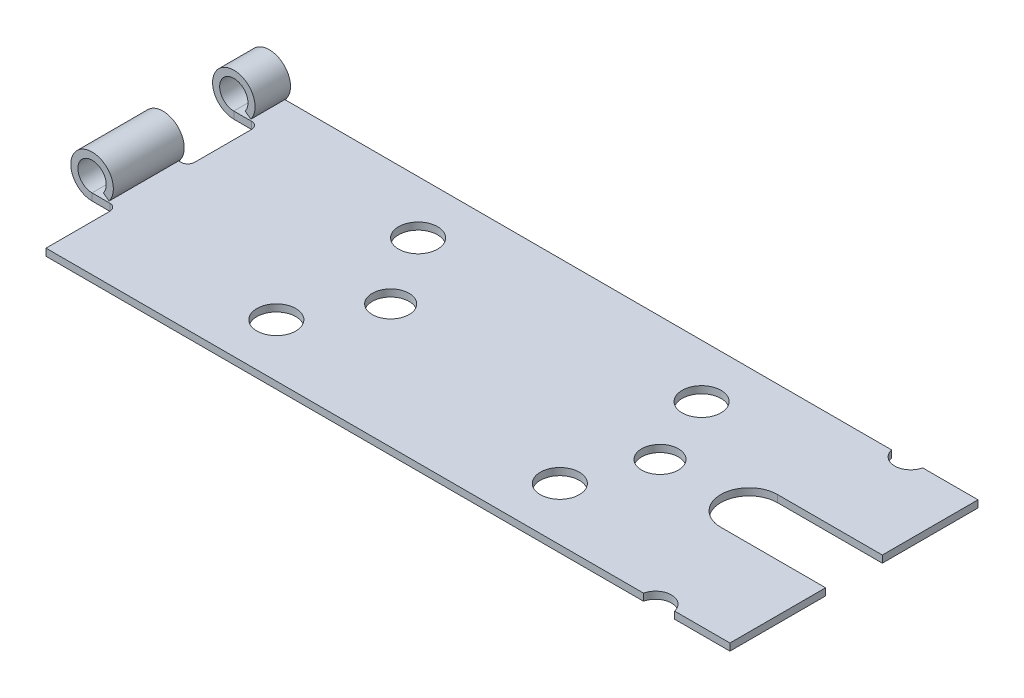
ISO-10303-21;
HEADER;
FILE_DESCRIPTION(('STEP AP214'),'2;1');
FILE_NAME('part.step','',(''),(''),'','','');
FILE_SCHEMA(('AUTOMOTIVE_DESIGN { 1 0 10303 214 1 1 1 1 }'));
ENDSEC;
DATA;
#1=APPLICATION_CONTEXT('core data for automotive mechanical design processes');
#2=APPLICATION_PROTOCOL_DEFINITION('international standard','automotive_design',2000,#1);
#3=PRODUCT_CONTEXT('',#1,'mechanical');
#4=PRODUCT('Part','Part','',(#3));
#5=PRODUCT_RELATED_PRODUCT_CATEGORY('part','',(#4));
#6=PRODUCT_DEFINITION_FORMATION('','',#4);
#7=PRODUCT_DEFINITION_CONTEXT('part definition',#1,'design');
#8=PRODUCT_DEFINITION('design','',#6,#7);
#9=PRODUCT_DEFINITION_SHAPE('','',#8);
#10=(LENGTH_UNIT() NAMED_UNIT(*) SI_UNIT(.MILLI.,.METRE.));
#11=(NAMED_UNIT(*) PLANE_ANGLE_UNIT() SI_UNIT($,.RADIAN.));
#12=(NAMED_UNIT(*) SI_UNIT($,.STERADIAN.) SOLID_ANGLE_UNIT());
#13=UNCERTAINTY_MEASURE_WITH_UNIT(LENGTH_MEASURE(1.E-05),#10,'distance_accuracy_value','');
#14=(GEOMETRIC_REPRESENTATION_CONTEXT(3) GLOBAL_UNCERTAINTY_ASSIGNED_CONTEXT((#13)) GLOBAL_UNIT_ASSIGNED_CONTEXT((#10,
#11,#12)) REPRESENTATION_CONTEXT('',''));
#15=CARTESIAN_POINT('',(0.,0.,0.));
#16=DIRECTION('',(0.,0.,1.));
#17=DIRECTION('',(1.,0.,0.));
#18=AXIS2_PLACEMENT_3D('',#15,#16,#17);
#19=CARTESIAN_POINT('',(100.,-2.,17.5));
#20=DIRECTION('',(1.,0.,0.));
#21=DIRECTION('',(0.,0.,-1.));
#22=AXIS2_PLACEMENT_3D('',#19,#20,#21);
#23=PLANE('',#22);
#24=DIRECTION('',(0.,-1.,0.));
#25=VECTOR('',#24,1.);
#26=CARTESIAN_POINT('',(100.000000000001,18.4234824115563,-3.99999999999196));
#27=LINE('',#26,#25);
#28=CARTESIAN_POINT('',(100.000000000001,-2.,-3.99999999999196));
#29=VERTEX_POINT('',#28);
#30=CARTESIAN_POINT('',(100.000000000001,-3.,-3.99999999999196));
#31=VERTEX_POINT('',#30);
#32=EDGE_CURVE('E215',#29,#31,#27,.T.);
#33=ORIENTED_EDGE('',*,*,#32,.T.);
#34=DIRECTION('',(0.,0.,-1.));
#35=VECTOR('',#34,1.);
#36=CARTESIAN_POINT('',(100.,-3.,17.5));
#37=LINE('',#36,#35);
#38=CARTESIAN_POINT('',(100.,-3.,-17.5));
#39=VERTEX_POINT('',#38);
#40=EDGE_CURVE('E244',#31,#39,#37,.T.);
#41=ORIENTED_EDGE('',*,*,#40,.T.);
#42=DIRECTION('',(0.,-1.,0.));
#43=VECTOR('',#42,1.);
#44=CARTESIAN_POINT('',(100.,-2.,-17.5));
#45=LINE('',#44,#43);
#46=CARTESIAN_POINT('',(100.,-2.,-17.5));
#47=VERTEX_POINT('',#46);
#48=EDGE_CURVE('E239',#47,#39,#45,.T.);
#49=ORIENTED_EDGE('',*,*,#48,.F.);
#50=DIRECTION('',(0.,0.,-1.));
#51=VECTOR('',#50,1.);
#52=CARTESIAN_POINT('',(100.,-2.,17.5));
#53=LINE('',#52,#51);
#54=EDGE_CURVE('E232',#29,#47,#53,.T.);
#55=ORIENTED_EDGE('',*,*,#54,.F.);
#56=EDGE_LOOP('',(#33,#41,#49,#55));
#57=FACE_BOUND('',#56,.T.);
#58=ADVANCED_FACE('F47',(#57),#23,.T.);
#59=CARTESIAN_POINT('',(0.,-2.,17.5));
#60=DIRECTION('',(0.,1.,0.));
#61=DIRECTION('',(0.,0.,1.));
#62=AXIS2_PLACEMENT_3D('',#59,#60,#61);
#63=PLANE('',#62);
#64=DIRECTION('',(1.,0.,4.23845544759916E-13));
#65=VECTOR('',#64,1.);
#66=CARTESIAN_POINT('',(85.2085489167266,-2.,-3.99999999999823));
#67=LINE('',#66,#65);
#68=CARTESIAN_POINT('',(85.2085489167266,-2.,-3.99999999999823));
#69=VERTEX_POINT('',#68);
#70=EDGE_CURVE('E218',#69,#29,#67,.T.);
#71=ORIENTED_EDGE('',*,*,#70,.T.);
#72=ORIENTED_EDGE('',*,*,#54,.T.);
#73=DIRECTION('',(1.,0.,0.));
#74=VECTOR('',#73,1.);
#75=CARTESIAN_POINT('',(0.,-2.,-17.5));
#76=LINE('',#75,#74);
#77=CARTESIAN_POINT('',(92.193741096848,-2.,-17.5));
#78=VERTEX_POINT('',#77);
#79=EDGE_CURVE('E405',#78,#47,#76,.T.);
#80=ORIENTED_EDGE('',*,*,#79,.F.);
#81=CARTESIAN_POINT('',(90.,-2.,-18.));
#82=DIRECTION('',(0.,1.,0.));
#83=DIRECTION('',(0.,0.,1.));
#84=AXIS2_PLACEMENT_3D('',#81,#82,#83);
#85=CIRCLE('',#84,2.25);
#86=CARTESIAN_POINT('',(87.806258903152,-2.,-17.5));
#87=VERTEX_POINT('',#86);
#88=EDGE_CURVE('E344',#87,#78,#85,.T.);
#89=ORIENTED_EDGE('',*,*,#88,.F.);
#90=CARTESIAN_POINT('',(0.,-2.,-17.5));
#91=VERTEX_POINT('',#90);
#92=EDGE_CURVE('E406',#91,#87,#76,.T.);
#93=ORIENTED_EDGE('',*,*,#92,.F.);
#94=DIRECTION('',(0.,0.,-1.));
#95=VECTOR('',#94,1.);
#96=CARTESIAN_POINT('',(0.,-2.,17.5));
#97=LINE('',#96,#95);
#98=CARTESIAN_POINT('',(0.,-2.,-12.5));
#99=VERTEX_POINT('',#98);
#100=EDGE_CURVE('E246',#99,#91,#97,.T.);
#101=ORIENTED_EDGE('',*,*,#100,.F.);
#102=DIRECTION('',(-1.,0.,0.));
#103=VECTOR('',#102,1.);
#104=CARTESIAN_POINT('',(0.,-2.,-12.5));
#105=LINE('',#104,#103);
#106=CARTESIAN_POINT('',(2.5,-2.,-12.5));
#107=VERTEX_POINT('',#106);
#108=EDGE_CURVE('E379',#107,#99,#105,.T.);
#109=ORIENTED_EDGE('',*,*,#108,.F.);
#110=CARTESIAN_POINT('',(2.5,-2.,-11.5));
#111=DIRECTION('',(0.,1.,0.));
#112=DIRECTION('',(0.,0.,1.));
#113=AXIS2_PLACEMENT_3D('',#110,#111,#112);
#114=CIRCLE('',#113,1.);
#115=CARTESIAN_POINT('',(3.5,-2.,-11.5));
#116=VERTEX_POINT('',#115);
#117=EDGE_CURVE('E299',#107,#116,#114,.F.);
#118=ORIENTED_EDGE('',*,*,#117,.T.);
#119=DIRECTION('',(0.,0.,-1.));
#120=VECTOR('',#119,1.);
#121=CARTESIAN_POINT('',(3.5,-2.,17.5));
#122=LINE('',#121,#120);
#123=CARTESIAN_POINT('',(3.5,-2.,-3.5));
#124=VERTEX_POINT('',#123);
#125=EDGE_CURVE('E267',#124,#116,#122,.T.);
#126=ORIENTED_EDGE('',*,*,#125,.F.);
#127=CARTESIAN_POINT('',(2.5,-2.,-3.5));
#128=DIRECTION('',(0.,1.,0.));
#129=DIRECTION('',(0.,0.,1.));
#130=AXIS2_PLACEMENT_3D('',#127,#128,#129);
#131=CIRCLE('',#130,1.);
#132=CARTESIAN_POINT('',(2.5,-2.,-2.5));
#133=VERTEX_POINT('',#132);
#134=EDGE_CURVE('E295',#124,#133,#131,.F.);
#135=ORIENTED_EDGE('',*,*,#134,.T.);
#136=DIRECTION('',(1.,0.,0.));
#137=VECTOR('',#136,1.);
#138=CARTESIAN_POINT('',(0.,-2.,-2.5));
#139=LINE('',#138,#137);
#140=CARTESIAN_POINT('',(0.,-2.,-2.5));
#141=VERTEX_POINT('',#140);
#142=EDGE_CURVE('E385',#141,#133,#139,.T.);
#143=ORIENTED_EDGE('',*,*,#142,.F.);
#144=CARTESIAN_POINT('',(0.,-2.,7.5));
#145=VERTEX_POINT('',#144);
#146=EDGE_CURVE('E241',#145,#141,#97,.T.);
#147=ORIENTED_EDGE('',*,*,#146,.F.);
#148=DIRECTION('',(-1.,0.,0.));
#149=VECTOR('',#148,1.);
#150=CARTESIAN_POINT('',(0.,-2.,7.5));
#151=LINE('',#150,#149);
#152=CARTESIAN_POINT('',(2.5,-2.,7.5));
#153=VERTEX_POINT('',#152);
#154=EDGE_CURVE('E373',#153,#145,#151,.T.);
#155=ORIENTED_EDGE('',*,*,#154,.F.);
#156=CARTESIAN_POINT('',(2.5,-2.,8.5));
#157=DIRECTION('',(0.,1.,0.));
#158=DIRECTION('',(0.,0.,1.));
#159=AXIS2_PLACEMENT_3D('',#156,#157,#158);
#160=CIRCLE('',#159,1.);
#161=CARTESIAN_POINT('',(3.5,-2.,8.5));
#162=VERTEX_POINT('',#161);
#163=EDGE_CURVE('E291',#153,#162,#160,.F.);
#164=ORIENTED_EDGE('',*,*,#163,.T.);
#165=DIRECTION('',(0.,0.,-1.));
#166=VECTOR('',#165,1.);
#167=CARTESIAN_POINT('',(3.5,-2.,17.5));
#168=LINE('',#167,#166);
#169=CARTESIAN_POINT('',(3.5,-2.,17.5));
#170=VERTEX_POINT('',#169);
#171=EDGE_CURVE('E363',#170,#162,#168,.T.);
#172=ORIENTED_EDGE('',*,*,#171,.F.);
#173=DIRECTION('',(1.,0.,0.));
#174=VECTOR('',#173,1.);
#175=CARTESIAN_POINT('',(0.,-2.,17.5));
#176=LINE('',#175,#174);
#177=CARTESIAN_POINT('',(87.806258903152,-2.,17.5));
#178=VERTEX_POINT('',#177);
#179=EDGE_CURVE('E397',#170,#178,#176,.T.);
#180=ORIENTED_EDGE('',*,*,#179,.T.);
#181=CARTESIAN_POINT('',(90.,-2.,18.));
#182=DIRECTION('',(0.,1.,0.));
#183=DIRECTION('',(0.,0.,1.));
#184=AXIS2_PLACEMENT_3D('',#181,#182,#183);
#185=CIRCLE('',#184,2.25);
#186=CARTESIAN_POINT('',(92.193741096848,-2.,17.5));
#187=VERTEX_POINT('',#186);
#188=EDGE_CURVE('E71',#187,#178,#185,.T.);
#189=ORIENTED_EDGE('',*,*,#188,.F.);
#190=CARTESIAN_POINT('',(100.,-2.,17.5));
#191=VERTEX_POINT('',#190);
#192=EDGE_CURVE('E396',#187,#191,#176,.T.);
#193=ORIENTED_EDGE('',*,*,#192,.T.);
#194=CARTESIAN_POINT('',(100.,-2.,4.00000000000832));
#195=VERTEX_POINT('',#194);
#196=EDGE_CURVE('E240',#191,#195,#53,.T.);
#197=ORIENTED_EDGE('',*,*,#196,.T.);
#198=DIRECTION('',(-1.,0.,-6.57230335593405E-13));
#199=VECTOR('',#198,1.);
#200=CARTESIAN_POINT('',(85.2085489167266,-2.,3.9999999999986));
#201=LINE('',#200,#199);
#202=CARTESIAN_POINT('',(85.2085489167266,-2.,3.9999999999986));
#203=VERTEX_POINT('',#202);
#204=EDGE_CURVE('E64',#195,#203,#201,.T.);
#205=ORIENTED_EDGE('',*,*,#204,.T.);
#206=CARTESIAN_POINT('',(85.2085489167266,-2.,1.87350135405495E-13));
#207=DIRECTION('',(0.,1.,0.));
#208=DIRECTION('',(0.,0.,1.));
#209=AXIS2_PLACEMENT_3D('',#206,#207,#208);
#210=CIRCLE('',#209,3.99999999999841);
#211=EDGE_CURVE('E234',#203,#69,#210,.F.);
#212=ORIENTED_EDGE('',*,*,#211,.T.);
#213=EDGE_LOOP('',(#71,#72,#80,#89,#93,#101,#109,#118,#126,#135,#143,#147,#155,#164,#172,#180,
#189,#193,#197,#205,#212));
#214=FACE_BOUND('',#213,.T.);
#215=CARTESIAN_POINT('',(34.6333571089049,-2.,-1.66533453693773E-13));
#216=DIRECTION('',(0.,1.,0.));
#217=DIRECTION('',(0.,0.,1.));
#218=AXIS2_PLACEMENT_3D('',#215,#216,#217);
#219=CIRCLE('',#218,2.6);
#220=CARTESIAN_POINT('',(34.6333571089049,-2.,2.59999999999983));
#221=VERTEX_POINT('',#220);
#222=EDGE_CURVE('E318',#221,#221,#219,.F.);
#223=ORIENTED_EDGE('',*,*,#222,.T.);
#224=EDGE_LOOP('',(#223));
#225=FACE_BOUND('',#224,.T.);
#226=CARTESIAN_POINT('',(28.5000000000001,-2.,-9.9999999999999));
#227=DIRECTION('',(0.,1.,0.));
#228=DIRECTION('',(0.,0.,1.));
#229=AXIS2_PLACEMENT_3D('',#226,#227,#228);
#230=CIRCLE('',#229,2.74999999999999);
#231=CARTESIAN_POINT('',(28.5000000000001,-2.,-7.24999999999991));
#232=VERTEX_POINT('',#231);
#233=EDGE_CURVE('E338',#232,#232,#230,.F.);
#234=ORIENTED_EDGE('',*,*,#233,.T.);
#235=EDGE_LOOP('',(#234));
#236=FACE_BOUND('',#235,.T.);
#237=CARTESIAN_POINT('',(28.5000000000001,-2.,10.0000000000001));
#238=DIRECTION('',(0.,1.,0.));
#239=DIRECTION('',(0.,0.,1.));
#240=AXIS2_PLACEMENT_3D('',#237,#238,#239);
#241=CIRCLE('',#240,2.74999999999999);
#242=CARTESIAN_POINT('',(28.5000000000001,-2.,12.7500000000001));
#243=VERTEX_POINT('',#242);
#244=EDGE_CURVE('E311',#243,#243,#241,.F.);
#245=ORIENTED_EDGE('',*,*,#244,.T.);
#246=EDGE_LOOP('',(#245));
#247=FACE_BOUND('',#246,.T.);
#248=CARTESIAN_POINT('',(68.5000000000001,-2.,10.0000000000001));
#249=DIRECTION('',(0.,1.,0.));
#250=DIRECTION('',(0.,0.,1.));
#251=AXIS2_PLACEMENT_3D('',#248,#249,#250);
#252=CIRCLE('',#251,2.75);
#253=CARTESIAN_POINT('',(68.5000000000001,-2.,12.7500000000001));
#254=VERTEX_POINT('',#253);
#255=EDGE_CURVE('E312',#254,#254,#252,.F.);
#256=ORIENTED_EDGE('',*,*,#255,.T.);
#257=EDGE_LOOP('',(#256));
#258=FACE_BOUND('',#257,.T.);
#259=CARTESIAN_POINT('',(68.5000000000001,-2.,-9.9999999999999));
#260=DIRECTION('',(0.,1.,0.));
#261=DIRECTION('',(0.,0.,1.));
#262=AXIS2_PLACEMENT_3D('',#259,#260,#261);
#263=CIRCLE('',#262,2.75);
#264=CARTESIAN_POINT('',(68.5000000000001,-2.,-7.2499999999999));
#265=VERTEX_POINT('',#264);
#266=EDGE_CURVE('E315',#265,#265,#263,.F.);
#267=ORIENTED_EDGE('',*,*,#266,.T.);
#268=EDGE_LOOP('',(#267));
#269=FACE_BOUND('',#268,.T.);
#270=CARTESIAN_POINT('',(72.6333571089049,-2.,-1.66533453693773E-13));
#271=DIRECTION('',(0.,1.,0.));
#272=DIRECTION('',(0.,0.,1.));
#273=AXIS2_PLACEMENT_3D('',#270,#271,#272);
#274=CIRCLE('',#273,2.6);
#275=CARTESIAN_POINT('',(72.6333571089049,-2.,2.59999999999983));
#276=VERTEX_POINT('',#275);
#277=EDGE_CURVE('E327',#276,#276,#274,.F.);
#278=ORIENTED_EDGE('',*,*,#277,.T.);
#279=EDGE_LOOP('',(#278));
#280=FACE_BOUND('',#279,.T.);
#281=ADVANCED_FACE('F229',(#214,#225,#236,#247,#258,#269,#280),#63,.T.);
#282=CARTESIAN_POINT('',(0.,0.,17.5));
#283=DIRECTION('',(0.,0.,1.));
#284=DIRECTION('',(1.,0.,0.));
#285=AXIS2_PLACEMENT_3D('',#282,#283,#284);
#286=PLANE('',#285);
#287=DIRECTION('',(0.,1.,0.));
#288=VECTOR('',#287,1.);
#289=CARTESIAN_POINT('',(92.193741096848,-3.,17.5));
#290=LINE('',#289,#288);
#291=CARTESIAN_POINT('',(92.193741096848,-3.,17.5));
#292=VERTEX_POINT('',#291);
#293=EDGE_CURVE('E12',#292,#187,#290,.T.);
#294=ORIENTED_EDGE('',*,*,#293,.F.);
#295=DIRECTION('',(1.,0.,0.));
#296=VECTOR('',#295,1.);
#297=CARTESIAN_POINT('',(0.,-3.,17.5));
#298=LINE('',#297,#296);
#299=CARTESIAN_POINT('',(100.,-3.,17.5));
#300=VERTEX_POINT('',#299);
#301=EDGE_CURVE('E393',#292,#300,#298,.T.);
#302=ORIENTED_EDGE('',*,*,#301,.T.);
#303=DIRECTION('',(0.,-1.,0.));
#304=VECTOR('',#303,1.);
#305=CARTESIAN_POINT('',(100.,-2.,17.5));
#306=LINE('',#305,#304);
#307=EDGE_CURVE('E392',#191,#300,#306,.T.);
#308=ORIENTED_EDGE('',*,*,#307,.F.);
#309=ORIENTED_EDGE('',*,*,#192,.F.);
#310=EDGE_LOOP('',(#294,#302,#308,#309));
#311=FACE_BOUND('',#310,.T.);
#312=ADVANCED_FACE('F517',(#311),#286,.T.);
#313=CARTESIAN_POINT('',(0.,0.,-17.5));
#314=DIRECTION('',(0.,0.,1.));
#315=DIRECTION('',(1.,0.,0.));
#316=AXIS2_PLACEMENT_3D('',#313,#314,#315);
#317=PLANE('',#316);
#318=DIRECTION('',(1.,0.,0.));
#319=VECTOR('',#318,1.);
#320=CARTESIAN_POINT('',(0.,-3.,-17.5));
#321=LINE('',#320,#319);
#322=CARTESIAN_POINT('',(92.193741096848,-3.,-17.5));
#323=VERTEX_POINT('',#322);
#324=EDGE_CURVE('E388',#323,#39,#321,.T.);
#325=ORIENTED_EDGE('',*,*,#324,.F.);
#326=DIRECTION('',(0.,1.,0.));
#327=VECTOR('',#326,1.);
#328=CARTESIAN_POINT('',(92.193741096848,-3.,-17.5));
#329=LINE('',#328,#327);
#330=EDGE_CURVE('E304',#323,#78,#329,.T.);
#331=ORIENTED_EDGE('',*,*,#330,.T.);
#332=ORIENTED_EDGE('',*,*,#79,.T.);
#333=ORIENTED_EDGE('',*,*,#48,.T.);
#334=EDGE_LOOP('',(#325,#331,#332,#333));
#335=FACE_BOUND('',#334,.T.);
#336=ADVANCED_FACE('F495',(#335),#317,.F.);
#337=CARTESIAN_POINT('',(-3.,3.,-12.5));
#338=DIRECTION('',(0.,0.,-1.));
#339=DIRECTION('',(-1.,0.,0.));
#340=AXIS2_PLACEMENT_3D('',#337,#338,#339);
#341=PLANE('',#340);
#342=DIRECTION('',(1.,0.,0.));
#343=VECTOR('',#342,1.);
#344=CARTESIAN_POINT('',(-3.,-3.,-12.5));
#345=LINE('',#344,#343);
#346=CARTESIAN_POINT('',(0.,-3.,-12.5));
#347=VERTEX_POINT('',#346);
#348=CARTESIAN_POINT('',(2.5,-3.,-12.5));
#349=VERTEX_POINT('',#348);
#350=EDGE_CURVE('E354',#347,#349,#345,.T.);
#351=ORIENTED_EDGE('',*,*,#350,.T.);
#352=DIRECTION('',(0.,-1.,0.));
#353=VECTOR('',#352,1.);
#354=CARTESIAN_POINT('',(2.5,-2.,-12.5));
#355=LINE('',#354,#353);
#356=EDGE_CURVE('E287',#349,#107,#355,.F.);
#357=ORIENTED_EDGE('',*,*,#356,.T.);
#358=ORIENTED_EDGE('',*,*,#108,.T.);
#359=DIRECTION('',(0.,-1.,0.));
#360=VECTOR('',#359,1.);
#361=CARTESIAN_POINT('',(0.,-2.,-12.5));
#362=LINE('',#361,#360);
#363=EDGE_CURVE('E272',#99,#347,#362,.T.);
#364=ORIENTED_EDGE('',*,*,#363,.T.);
#365=EDGE_LOOP('',(#351,#357,#358,#364));
#366=FACE_BOUND('',#365,.T.);
#367=ADVANCED_FACE('F472',(#366),#341,.F.);
#368=CARTESIAN_POINT('',(-3.,3.,7.5));
#369=DIRECTION('',(0.,0.,-1.));
#370=DIRECTION('',(-1.,0.,0.));
#371=AXIS2_PLACEMENT_3D('',#368,#369,#370);
#372=PLANE('',#371);
#373=DIRECTION('',(1.,0.,0.));
#374=VECTOR('',#373,1.);
#375=CARTESIAN_POINT('',(-3.,-3.,7.5));
#376=LINE('',#375,#374);
#377=CARTESIAN_POINT('',(0.,-3.,7.5));
#378=VERTEX_POINT('',#377);
#379=CARTESIAN_POINT('',(2.5,-3.,7.5));
#380=VERTEX_POINT('',#379);
#381=EDGE_CURVE('E348',#378,#380,#376,.T.);
#382=ORIENTED_EDGE('',*,*,#381,.T.);
#383=DIRECTION('',(0.,-1.,0.));
#384=VECTOR('',#383,1.);
#385=CARTESIAN_POINT('',(2.5,-2.,7.5));
#386=LINE('',#385,#384);
#387=EDGE_CURVE('E277',#380,#153,#386,.F.);
#388=ORIENTED_EDGE('',*,*,#387,.T.);
#389=ORIENTED_EDGE('',*,*,#154,.T.);
#390=DIRECTION('',(0.,-1.,0.));
#391=VECTOR('',#390,1.);
#392=CARTESIAN_POINT('',(0.,-2.,7.5));
#393=LINE('',#392,#391);
#394=EDGE_CURVE('E270',#145,#378,#393,.T.);
#395=ORIENTED_EDGE('',*,*,#394,.T.);
#396=EDGE_LOOP('',(#382,#388,#389,#395));
#397=FACE_BOUND('',#396,.T.);
#398=ADVANCED_FACE('F740',(#397),#372,.F.);
#399=CARTESIAN_POINT('',(0.,0.,17.5));
#400=DIRECTION('',(0.,0.,-1.));
#401=DIRECTION('',(-1.,0.,0.));
#402=AXIS2_PLACEMENT_3D('',#399,#400,#401);
#403=CYLINDRICAL_SURFACE('',#402,2.);
#404=CARTESIAN_POINT('',(0.,0.,-2.5));
#405=DIRECTION('',(0.,0.,1.));
#406=DIRECTION('',(1.,0.,0.));
#407=AXIS2_PLACEMENT_3D('',#404,#405,#406);
#408=CIRCLE('',#407,2.);
#409=CARTESIAN_POINT('',(1.6,-1.2,-2.5));
#410=VERTEX_POINT('',#409);
#411=EDGE_CURVE('E383',#410,#141,#408,.T.);
#412=ORIENTED_EDGE('',*,*,#411,.F.);
#413=DIRECTION('',(0.,0.,-1.));
#414=VECTOR('',#413,1.);
#415=CARTESIAN_POINT('',(1.6,-1.2,17.5));
#416=LINE('',#415,#414);
#417=CARTESIAN_POINT('',(1.6,-1.2,7.5));
#418=VERTEX_POINT('',#417);
#419=EDGE_CURVE('E423',#418,#410,#416,.T.);
#420=ORIENTED_EDGE('',*,*,#419,.F.);
#421=CARTESIAN_POINT('',(0.,0.,7.5));
#422=DIRECTION('',(0.,0.,-1.));
#423=DIRECTION('',(-1.,0.,0.));
#424=AXIS2_PLACEMENT_3D('',#421,#422,#423);
#425=CIRCLE('',#424,2.);
#426=EDGE_CURVE('E371',#145,#418,#425,.T.);
#427=ORIENTED_EDGE('',*,*,#426,.F.);
#428=ORIENTED_EDGE('',*,*,#146,.T.);
#429=EDGE_LOOP('',(#412,#420,#427,#428));
#430=FACE_BOUND('',#429,.T.);
#431=ADVANCED_FACE('F447',(#430),#403,.F.);
#432=CARTESIAN_POINT('',(2.4,-1.8,17.5));
#433=DIRECTION('',(-0.6,-0.8,0.));
#434=DIRECTION('',(0.8,-0.6,0.));
#435=AXIS2_PLACEMENT_3D('',#432,#433,#434);
#436=PLANE('',#435);
#437=DIRECTION('',(-0.8,0.6,0.));
#438=VECTOR('',#437,1.);
#439=CARTESIAN_POINT('',(2.4,-1.8,-2.5));
#440=LINE('',#439,#438);
#441=CARTESIAN_POINT('',(2.4,-1.8,-2.5));
#442=VERTEX_POINT('',#441);
#443=EDGE_CURVE('E381',#442,#410,#440,.T.);
#444=ORIENTED_EDGE('',*,*,#443,.F.);
#445=DIRECTION('',(0.,0.,-1.));
#446=VECTOR('',#445,1.);
#447=CARTESIAN_POINT('',(2.4,-1.8,17.5));
#448=LINE('',#447,#446);
#449=CARTESIAN_POINT('',(2.4,-1.8,7.5));
#450=VERTEX_POINT('',#449);
#451=EDGE_CURVE('E421',#450,#442,#448,.T.);
#452=ORIENTED_EDGE('',*,*,#451,.F.);
#453=DIRECTION('',(0.8,-0.6,0.));
#454=VECTOR('',#453,1.);
#455=CARTESIAN_POINT('',(2.4,-1.8,7.5));
#456=LINE('',#455,#454);
#457=EDGE_CURVE('E369',#418,#450,#456,.T.);
#458=ORIENTED_EDGE('',*,*,#457,.F.);
#459=ORIENTED_EDGE('',*,*,#419,.T.);
#460=EDGE_LOOP('',(#444,#452,#458,#459));
#461=FACE_BOUND('',#460,.T.);
#462=ADVANCED_FACE('F440',(#461),#436,.T.);
#463=CARTESIAN_POINT('',(0.,0.,17.5));
#464=DIRECTION('',(0.,0.,-1.));
#465=DIRECTION('',(-1.,0.,0.));
#466=AXIS2_PLACEMENT_3D('',#463,#464,#465);
#467=CYLINDRICAL_SURFACE('',#466,3.);
#468=ORIENTED_EDGE('',*,*,#451,.T.);
#469=CARTESIAN_POINT('',(0.,0.,-2.5));
#470=DIRECTION('',(0.,0.,1.));
#471=DIRECTION('',(1.,0.,0.));
#472=AXIS2_PLACEMENT_3D('',#469,#470,#471);
#473=CIRCLE('',#472,3.);
#474=CARTESIAN_POINT('',(0.,-3.,-2.5));
#475=VERTEX_POINT('',#474);
#476=EDGE_CURVE('E264',#442,#475,#473,.T.);
#477=ORIENTED_EDGE('',*,*,#476,.T.);
#478=DIRECTION('',(0.,0.,-1.));
#479=VECTOR('',#478,1.);
#480=CARTESIAN_POINT('',(0.,-3.,17.5));
#481=LINE('',#480,#479);
#482=EDGE_CURVE('E419',#378,#475,#481,.T.);
#483=ORIENTED_EDGE('',*,*,#482,.F.);
#484=CARTESIAN_POINT('',(0.,0.,7.5));
#485=DIRECTION('',(0.,0.,-1.));
#486=DIRECTION('',(-1.,0.,0.));
#487=AXIS2_PLACEMENT_3D('',#484,#485,#486);
#488=CIRCLE('',#487,3.);
#489=EDGE_CURVE('E258',#378,#450,#488,.T.);
#490=ORIENTED_EDGE('',*,*,#489,.T.);
#491=EDGE_LOOP('',(#468,#477,#483,#490));
#492=FACE_BOUND('',#491,.T.);
#493=ADVANCED_FACE('F433',(#492),#467,.T.);
#494=CARTESIAN_POINT('',(0.,-3.,-17.5));
#495=DIRECTION('',(0.,0.,-1.));
#496=DIRECTION('',(-1.,0.,0.));
#497=AXIS2_PLACEMENT_3D('',#494,#495,#496);
#498=PLANE('',#497);
#499=DIRECTION('',(0.,1.,0.));
#500=VECTOR('',#499,1.);
#501=CARTESIAN_POINT('',(0.,-3.,-17.5));
#502=LINE('',#501,#500);
#503=CARTESIAN_POINT('',(0.,-3.,-17.5));
#504=VERTEX_POINT('',#503);
#505=EDGE_CURVE('E253',#504,#91,#502,.T.);
#506=ORIENTED_EDGE('',*,*,#505,.F.);
#507=CARTESIAN_POINT('',(0.,0.,-17.5));
#508=DIRECTION('',(0.,0.,1.));
#509=DIRECTION('',(1.,0.,0.));
#510=AXIS2_PLACEMENT_3D('',#507,#508,#509);
#511=CIRCLE('',#510,3.);
#512=CARTESIAN_POINT('',(2.4,-1.8,-17.5));
#513=VERTEX_POINT('',#512);
#514=EDGE_CURVE('E415',#513,#504,#511,.T.);
#515=ORIENTED_EDGE('',*,*,#514,.F.);
#516=DIRECTION('',(-0.8,0.6,0.));
#517=VECTOR('',#516,1.);
#518=CARTESIAN_POINT('',(2.4,-1.8,-17.5));
#519=LINE('',#518,#517);
#520=CARTESIAN_POINT('',(1.6,-1.2,-17.5));
#521=VERTEX_POINT('',#520);
#522=EDGE_CURVE('E412',#513,#521,#519,.T.);
#523=ORIENTED_EDGE('',*,*,#522,.T.);
#524=CARTESIAN_POINT('',(0.,0.,-17.5));
#525=DIRECTION('',(0.,0.,1.));
#526=DIRECTION('',(1.,0.,0.));
#527=AXIS2_PLACEMENT_3D('',#524,#525,#526);
#528=CIRCLE('',#527,2.);
#529=EDGE_CURVE('E409',#521,#91,#528,.T.);
#530=ORIENTED_EDGE('',*,*,#529,.T.);
#531=EDGE_LOOP('',(#506,#515,#523,#530));
#532=FACE_BOUND('',#531,.T.);
#533=ADVANCED_FACE('F486',(#532),#498,.T.);
#534=CARTESIAN_POINT('',(0.,-3.,17.5));
#535=DIRECTION('',(0.,1.,0.));
#536=DIRECTION('',(0.,0.,1.));
#537=AXIS2_PLACEMENT_3D('',#534,#535,#536);
#538=PLANE('',#537);
#539=ORIENTED_EDGE('',*,*,#40,.F.);
#540=DIRECTION('',(1.,0.,4.23845544759916E-13));
#541=VECTOR('',#540,1.);
#542=CARTESIAN_POINT('',(85.2085489167266,-3.,-3.99999999999823));
#543=LINE('',#542,#541);
#544=CARTESIAN_POINT('',(85.2085489167266,-3.,-3.99999999999823));
#545=VERTEX_POINT('',#544);
#546=EDGE_CURVE('E221',#545,#31,#543,.T.);
#547=ORIENTED_EDGE('',*,*,#546,.F.);
#548=CARTESIAN_POINT('',(85.2085489167266,-3.,1.87350135405495E-13));
#549=DIRECTION('',(0.,-1.,0.));
#550=DIRECTION('',(0.,0.,-1.));
#551=AXIS2_PLACEMENT_3D('',#548,#549,#550);
#552=CIRCLE('',#551,3.99999999999841);
#553=CARTESIAN_POINT('',(85.2085489167266,-3.,3.9999999999986));
#554=VERTEX_POINT('',#553);
#555=EDGE_CURVE('E542',#554,#545,#552,.T.);
#556=ORIENTED_EDGE('',*,*,#555,.F.);
#557=DIRECTION('',(-1.,0.,-6.57230335593405E-13));
#558=VECTOR('',#557,1.);
#559=CARTESIAN_POINT('',(85.2085489167266,-3.,3.9999999999986));
#560=LINE('',#559,#558);
#561=CARTESIAN_POINT('',(100.000000000001,-3.,4.00000000000832));
#562=VERTEX_POINT('',#561);
#563=EDGE_CURVE('E235',#562,#554,#560,.T.);
#564=ORIENTED_EDGE('',*,*,#563,.F.);
#565=EDGE_CURVE('E250',#300,#562,#37,.T.);
#566=ORIENTED_EDGE('',*,*,#565,.F.);
#567=ORIENTED_EDGE('',*,*,#301,.F.);
#568=CARTESIAN_POINT('',(90.,-3.,18.));
#569=DIRECTION('',(0.,1.,0.));
#570=DIRECTION('',(0.,0.,1.));
#571=AXIS2_PLACEMENT_3D('',#568,#569,#570);
#572=CIRCLE('',#571,2.25);
#573=CARTESIAN_POINT('',(87.806258903152,-3.,17.5));
#574=VERTEX_POINT('',#573);
#575=EDGE_CURVE('E345',#292,#574,#572,.T.);
#576=ORIENTED_EDGE('',*,*,#575,.T.);
#577=CARTESIAN_POINT('',(3.5,-3.,17.5));
#578=VERTEX_POINT('',#577);
#579=EDGE_CURVE('E389',#578,#574,#298,.T.);
#580=ORIENTED_EDGE('',*,*,#579,.F.);
#581=DIRECTION('',(0.,0.,1.));
#582=VECTOR('',#581,1.);
#583=CARTESIAN_POINT('',(3.5,-3.,17.5));
#584=LINE('',#583,#582);
#585=CARTESIAN_POINT('',(3.5,-3.,8.5));
#586=VERTEX_POINT('',#585);
#587=EDGE_CURVE('E358',#586,#578,#584,.T.);
#588=ORIENTED_EDGE('',*,*,#587,.F.);
#589=CARTESIAN_POINT('',(2.5,-3.,8.5));
#590=DIRECTION('',(0.,1.,0.));
#591=DIRECTION('',(0.,0.,1.));
#592=AXIS2_PLACEMENT_3D('',#589,#590,#591);
#593=CIRCLE('',#592,1.);
#594=EDGE_CURVE('E289',#586,#380,#593,.T.);
#595=ORIENTED_EDGE('',*,*,#594,.T.);
#596=ORIENTED_EDGE('',*,*,#381,.F.);
#597=ORIENTED_EDGE('',*,*,#482,.T.);
#598=DIRECTION('',(-1.,0.,0.));
#599=VECTOR('',#598,1.);
#600=CARTESIAN_POINT('',(-3.,-3.,-2.5));
#601=LINE('',#600,#599);
#602=CARTESIAN_POINT('',(2.5,-3.,-2.5));
#603=VERTEX_POINT('',#602);
#604=EDGE_CURVE('E361',#603,#475,#601,.T.);
#605=ORIENTED_EDGE('',*,*,#604,.F.);
#606=CARTESIAN_POINT('',(2.5,-3.,-3.5));
#607=DIRECTION('',(0.,1.,0.));
#608=DIRECTION('',(0.,0.,1.));
#609=AXIS2_PLACEMENT_3D('',#606,#607,#608);
#610=CIRCLE('',#609,1.);
#611=CARTESIAN_POINT('',(3.5,-3.,-3.5));
#612=VERTEX_POINT('',#611);
#613=EDGE_CURVE('E293',#603,#612,#610,.T.);
#614=ORIENTED_EDGE('',*,*,#613,.T.);
#615=DIRECTION('',(0.,0.,1.));
#616=VECTOR('',#615,1.);
#617=CARTESIAN_POINT('',(3.5,-3.,-12.5));
#618=LINE('',#617,#616);
#619=CARTESIAN_POINT('',(3.5,-3.,-11.5));
#620=VERTEX_POINT('',#619);
#621=EDGE_CURVE('E357',#620,#612,#618,.T.);
#622=ORIENTED_EDGE('',*,*,#621,.F.);
#623=CARTESIAN_POINT('',(2.5,-3.,-11.5));
#624=DIRECTION('',(0.,1.,0.));
#625=DIRECTION('',(0.,0.,1.));
#626=AXIS2_PLACEMENT_3D('',#623,#624,#625);
#627=CIRCLE('',#626,1.);
#628=EDGE_CURVE('E297',#620,#349,#627,.T.);
#629=ORIENTED_EDGE('',*,*,#628,.T.);
#630=ORIENTED_EDGE('',*,*,#350,.F.);
#631=EDGE_CURVE('E400',#347,#504,#481,.T.);
#632=ORIENTED_EDGE('',*,*,#631,.T.);
#633=CARTESIAN_POINT('',(87.806258903152,-3.,-17.5));
#634=VERTEX_POINT('',#633);
#635=EDGE_CURVE('E401',#504,#634,#321,.T.);
#636=ORIENTED_EDGE('',*,*,#635,.T.);
#637=CARTESIAN_POINT('',(90.,-3.,-18.));
#638=DIRECTION('',(0.,1.,0.));
#639=DIRECTION('',(0.,0.,1.));
#640=AXIS2_PLACEMENT_3D('',#637,#638,#639);
#641=CIRCLE('',#640,2.25);
#642=EDGE_CURVE('E350',#634,#323,#641,.T.);
#643=ORIENTED_EDGE('',*,*,#642,.T.);
#644=ORIENTED_EDGE('',*,*,#324,.T.);
#645=EDGE_LOOP('',(#539,#547,#556,#564,#566,#567,#576,#580,#588,#595,#596,#597,#605,#614,#622,
#629,#630,#632,#636,#643,#644));
#646=FACE_BOUND('',#645,.T.);
#647=CARTESIAN_POINT('',(72.6333571089049,-3.,-1.66533453693773E-13));
#648=DIRECTION('',(0.,1.,0.));
#649=DIRECTION('',(0.,0.,1.));
#650=AXIS2_PLACEMENT_3D('',#647,#648,#649);
#651=CIRCLE('',#650,2.6);
#652=CARTESIAN_POINT('',(72.6333571089049,-3.,2.59999999999983));
#653=VERTEX_POINT('',#652);
#654=EDGE_CURVE('E51',#653,#653,#651,.T.);
#655=ORIENTED_EDGE('',*,*,#654,.T.);
#656=EDGE_LOOP('',(#655));
#657=FACE_BOUND('',#656,.T.);
#658=CARTESIAN_POINT('',(34.6333571089049,-3.,-1.66533453693773E-13));
#659=DIRECTION('',(0.,1.,0.));
#660=DIRECTION('',(0.,0.,1.));
#661=AXIS2_PLACEMENT_3D('',#658,#659,#660);
#662=CIRCLE('',#661,2.6);
#663=CARTESIAN_POINT('',(34.6333571089049,-3.,2.59999999999983));
#664=VERTEX_POINT('',#663);
#665=EDGE_CURVE('E316',#664,#664,#662,.T.);
#666=ORIENTED_EDGE('',*,*,#665,.T.);
#667=EDGE_LOOP('',(#666));
#668=FACE_BOUND('',#667,.T.);
#669=CARTESIAN_POINT('',(68.5000000000001,-3.,-9.9999999999999));
#670=DIRECTION('',(0.,1.,0.));
#671=DIRECTION('',(0.,0.,1.));
#672=AXIS2_PLACEMENT_3D('',#669,#670,#671);
#673=CIRCLE('',#672,2.75);
#674=CARTESIAN_POINT('',(68.5000000000001,-3.,-7.2499999999999));
#675=VERTEX_POINT('',#674);
#676=EDGE_CURVE('E313',#675,#675,#673,.T.);
#677=ORIENTED_EDGE('',*,*,#676,.T.);
#678=EDGE_LOOP('',(#677));
#679=FACE_BOUND('',#678,.T.);
#680=CARTESIAN_POINT('',(68.5000000000001,-3.,10.0000000000001));
#681=DIRECTION('',(0.,1.,0.));
#682=DIRECTION('',(0.,0.,1.));
#683=AXIS2_PLACEMENT_3D('',#680,#681,#682);
#684=CIRCLE('',#683,2.75);
#685=CARTESIAN_POINT('',(68.5000000000001,-3.,12.7500000000001));
#686=VERTEX_POINT('',#685);
#687=EDGE_CURVE('E308',#686,#686,#684,.T.);
#688=ORIENTED_EDGE('',*,*,#687,.T.);
#689=EDGE_LOOP('',(#688));
#690=FACE_BOUND('',#689,.T.);
#691=CARTESIAN_POINT('',(28.5000000000001,-3.,10.0000000000001));
#692=DIRECTION('',(0.,1.,0.));
#693=DIRECTION('',(0.,0.,1.));
#694=AXIS2_PLACEMENT_3D('',#691,#692,#693);
#695=CIRCLE('',#694,2.74999999999999);
#696=CARTESIAN_POINT('',(28.5000000000001,-3.,12.7500000000001));
#697=VERTEX_POINT('',#696);
#698=EDGE_CURVE('E335',#697,#697,#695,.T.);
#699=ORIENTED_EDGE('',*,*,#698,.T.);
#700=EDGE_LOOP('',(#699));
#701=FACE_BOUND('',#700,.T.);
#702=CARTESIAN_POINT('',(28.5000000000001,-3.,-9.9999999999999));
#703=DIRECTION('',(0.,1.,0.));
#704=DIRECTION('',(0.,0.,1.));
#705=AXIS2_PLACEMENT_3D('',#702,#703,#704);
#706=CIRCLE('',#705,2.74999999999999);
#707=CARTESIAN_POINT('',(28.5000000000001,-3.,-7.24999999999991));
#708=VERTEX_POINT('',#707);
#709=EDGE_CURVE('E341',#708,#708,#706,.T.);
#710=ORIENTED_EDGE('',*,*,#709,.T.);
#711=EDGE_LOOP('',(#710));
#712=FACE_BOUND('',#711,.T.);
#713=ADVANCED_FACE('F461',(#646,#657,#668,#679,#690,#701,#712),#538,.F.);
#714=DIRECTION('',(0.,-1.,0.));
#715=VECTOR('',#714,1.);
#716=CARTESIAN_POINT('',(100.000000000001,18.4234824115563,4.00000000000832));
#717=LINE('',#716,#715);
#718=EDGE_CURVE('E225',#195,#562,#717,.T.);
#719=ORIENTED_EDGE('',*,*,#718,.F.);
#720=ORIENTED_EDGE('',*,*,#196,.F.);
#721=ORIENTED_EDGE('',*,*,#307,.T.);
#722=ORIENTED_EDGE('',*,*,#565,.T.);
#723=EDGE_LOOP('',(#719,#720,#721,#722));
#724=FACE_BOUND('',#723,.T.);
#725=ADVANCED_FACE('F512',(#724),#23,.T.);
#726=CARTESIAN_POINT('',(0.,0.,-12.5));
#727=DIRECTION('',(0.,0.,-1.));
#728=DIRECTION('',(-1.,0.,0.));
#729=AXIS2_PLACEMENT_3D('',#726,#727,#728);
#730=CIRCLE('',#729,2.);
#731=CARTESIAN_POINT('',(1.6,-1.2,-12.5));
#732=VERTEX_POINT('',#731);
#733=EDGE_CURVE('E377',#99,#732,#730,.T.);
#734=ORIENTED_EDGE('',*,*,#733,.F.);
#735=ORIENTED_EDGE('',*,*,#100,.T.);
#736=ORIENTED_EDGE('',*,*,#529,.F.);
#737=EDGE_CURVE('E422',#732,#521,#416,.T.);
#738=ORIENTED_EDGE('',*,*,#737,.F.);
#739=EDGE_LOOP('',(#734,#735,#736,#738));
#740=FACE_BOUND('',#739,.T.);
#741=ADVANCED_FACE('F521',(#740),#403,.F.);
#742=DIRECTION('',(0.8,-0.6,0.));
#743=VECTOR('',#742,1.);
#744=CARTESIAN_POINT('',(2.39999999999999,-1.8,-12.5));
#745=LINE('',#744,#743);
#746=CARTESIAN_POINT('',(2.4,-1.8,-12.5));
#747=VERTEX_POINT('',#746);
#748=EDGE_CURVE('E375',#732,#747,#745,.T.);
#749=ORIENTED_EDGE('',*,*,#748,.F.);
#750=ORIENTED_EDGE('',*,*,#737,.T.);
#751=ORIENTED_EDGE('',*,*,#522,.F.);
#752=EDGE_CURVE('E420',#747,#513,#448,.T.);
#753=ORIENTED_EDGE('',*,*,#752,.F.);
#754=EDGE_LOOP('',(#749,#750,#751,#753));
#755=FACE_BOUND('',#754,.T.);
#756=ADVANCED_FACE('F483',(#755),#436,.T.);
#757=ORIENTED_EDGE('',*,*,#631,.F.);
#758=CARTESIAN_POINT('',(0.,0.,-12.5));
#759=DIRECTION('',(0.,0.,-1.));
#760=DIRECTION('',(-1.,0.,0.));
#761=AXIS2_PLACEMENT_3D('',#758,#759,#760);
#762=CIRCLE('',#761,3.);
#763=EDGE_CURVE('E261',#347,#747,#762,.T.);
#764=ORIENTED_EDGE('',*,*,#763,.T.);
#765=ORIENTED_EDGE('',*,*,#752,.T.);
#766=ORIENTED_EDGE('',*,*,#514,.T.);
#767=EDGE_LOOP('',(#757,#764,#765,#766));
#768=FACE_BOUND('',#767,.T.);
#769=ADVANCED_FACE('F481',(#768),#467,.T.);
#770=DIRECTION('',(0.,1.,0.));
#771=VECTOR('',#770,1.);
#772=CARTESIAN_POINT('',(87.806258903152,-3.,17.5));
#773=LINE('',#772,#771);
#774=EDGE_CURVE('E56',#178,#574,#773,.F.);
#775=ORIENTED_EDGE('',*,*,#774,.F.);
#776=ORIENTED_EDGE('',*,*,#179,.F.);
#777=DIRECTION('',(0.,1.,0.));
#778=VECTOR('',#777,1.);
#779=CARTESIAN_POINT('',(3.5,0.,17.5));
#780=LINE('',#779,#778);
#781=EDGE_CURVE('E256',#578,#170,#780,.T.);
#782=ORIENTED_EDGE('',*,*,#781,.F.);
#783=ORIENTED_EDGE('',*,*,#579,.T.);
#784=EDGE_LOOP('',(#775,#776,#782,#783));
#785=FACE_BOUND('',#784,.T.);
#786=ADVANCED_FACE('F659',(#785),#286,.T.);
#787=ORIENTED_EDGE('',*,*,#92,.T.);
#788=DIRECTION('',(0.,1.,0.));
#789=VECTOR('',#788,1.);
#790=CARTESIAN_POINT('',(87.806258903152,-3.,-17.5));
#791=LINE('',#790,#789);
#792=EDGE_CURVE('E301',#87,#634,#791,.F.);
#793=ORIENTED_EDGE('',*,*,#792,.T.);
#794=ORIENTED_EDGE('',*,*,#635,.F.);
#795=ORIENTED_EDGE('',*,*,#505,.T.);
#796=EDGE_LOOP('',(#787,#793,#794,#795));
#797=FACE_BOUND('',#796,.T.);
#798=ADVANCED_FACE('F489',(#797),#317,.F.);
#799=ORIENTED_EDGE('',*,*,#394,.F.);
#800=ORIENTED_EDGE('',*,*,#426,.T.);
#801=ORIENTED_EDGE('',*,*,#457,.T.);
#802=ORIENTED_EDGE('',*,*,#489,.F.);
#803=EDGE_LOOP('',(#799,#800,#801,#802));
#804=FACE_BOUND('',#803,.T.);
#805=ADVANCED_FACE('F727',(#804),#372,.F.);
#806=CARTESIAN_POINT('',(3.5,3.,17.5));
#807=DIRECTION('',(1.,0.,0.));
#808=DIRECTION('',(0.,0.,-1.));
#809=AXIS2_PLACEMENT_3D('',#806,#807,#808);
#810=PLANE('',#809);
#811=ORIENTED_EDGE('',*,*,#171,.T.);
#812=DIRECTION('',(0.,-1.,0.));
#813=VECTOR('',#812,1.);
#814=CARTESIAN_POINT('',(3.5,-3.,8.5));
#815=LINE('',#814,#813);
#816=EDGE_CURVE('E274',#162,#586,#815,.T.);
#817=ORIENTED_EDGE('',*,*,#816,.T.);
#818=ORIENTED_EDGE('',*,*,#587,.T.);
#819=ORIENTED_EDGE('',*,*,#781,.T.);
#820=EDGE_LOOP('',(#811,#817,#818,#819));
#821=FACE_BOUND('',#820,.T.);
#822=ADVANCED_FACE('F718',(#821),#810,.F.);
#823=CARTESIAN_POINT('',(-3.,3.,-2.5));
#824=DIRECTION('',(0.,0.,1.));
#825=DIRECTION('',(1.,0.,0.));
#826=AXIS2_PLACEMENT_3D('',#823,#824,#825);
#827=PLANE('',#826);
#828=ORIENTED_EDGE('',*,*,#142,.T.);
#829=DIRECTION('',(0.,-1.,0.));
#830=VECTOR('',#829,1.);
#831=CARTESIAN_POINT('',(2.5,-3.,-2.5));
#832=LINE('',#831,#830);
#833=EDGE_CURVE('E279',#133,#603,#832,.T.);
#834=ORIENTED_EDGE('',*,*,#833,.T.);
#835=ORIENTED_EDGE('',*,*,#604,.T.);
#836=ORIENTED_EDGE('',*,*,#476,.F.);
#837=ORIENTED_EDGE('',*,*,#443,.T.);
#838=ORIENTED_EDGE('',*,*,#411,.T.);
#839=EDGE_LOOP('',(#828,#834,#835,#836,#837,#838));
#840=FACE_BOUND('',#839,.T.);
#841=ADVANCED_FACE('F444',(#840),#827,.F.);
#842=ORIENTED_EDGE('',*,*,#363,.F.);
#843=ORIENTED_EDGE('',*,*,#733,.T.);
#844=ORIENTED_EDGE('',*,*,#748,.T.);
#845=ORIENTED_EDGE('',*,*,#763,.F.);
#846=EDGE_LOOP('',(#842,#843,#844,#845));
#847=FACE_BOUND('',#846,.T.);
#848=ADVANCED_FACE('F478',(#847),#341,.F.);
#849=CARTESIAN_POINT('',(3.5,3.,-12.5));
#850=DIRECTION('',(1.,0.,0.));
#851=DIRECTION('',(0.,0.,-1.));
#852=AXIS2_PLACEMENT_3D('',#849,#850,#851);
#853=PLANE('',#852);
#854=ORIENTED_EDGE('',*,*,#621,.T.);
#855=DIRECTION('',(0.,-1.,0.));
#856=VECTOR('',#855,1.);
#857=CARTESIAN_POINT('',(3.5,-2.,-3.5));
#858=LINE('',#857,#856);
#859=EDGE_CURVE('E285',#612,#124,#858,.F.);
#860=ORIENTED_EDGE('',*,*,#859,.T.);
#861=ORIENTED_EDGE('',*,*,#125,.T.);
#862=DIRECTION('',(0.,-1.,0.));
#863=VECTOR('',#862,1.);
#864=CARTESIAN_POINT('',(3.5,-3.,-11.5));
#865=LINE('',#864,#863);
#866=EDGE_CURVE('E282',#116,#620,#865,.T.);
#867=ORIENTED_EDGE('',*,*,#866,.T.);
#868=EDGE_LOOP('',(#854,#860,#861,#867));
#869=FACE_BOUND('',#868,.T.);
#870=ADVANCED_FACE('F464',(#869),#853,.F.);
#871=CARTESIAN_POINT('',(2.5,3.,8.5));
#872=DIRECTION('',(0.,1.,0.));
#873=DIRECTION('',(0.,0.,1.));
#874=AXIS2_PLACEMENT_3D('',#871,#872,#873);
#875=CYLINDRICAL_SURFACE('',#874,1.);
#876=ORIENTED_EDGE('',*,*,#163,.F.);
#877=ORIENTED_EDGE('',*,*,#387,.F.);
#878=ORIENTED_EDGE('',*,*,#594,.F.);
#879=ORIENTED_EDGE('',*,*,#816,.F.);
#880=EDGE_LOOP('',(#876,#877,#878,#879));
#881=FACE_BOUND('',#880,.T.);
#882=ADVANCED_FACE('F683',(#881),#875,.F.);
#883=CARTESIAN_POINT('',(2.5,3.,-3.5));
#884=DIRECTION('',(0.,1.,0.));
#885=DIRECTION('',(0.,0.,1.));
#886=AXIS2_PLACEMENT_3D('',#883,#884,#885);
#887=CYLINDRICAL_SURFACE('',#886,1.);
#888=ORIENTED_EDGE('',*,*,#134,.F.);
#889=ORIENTED_EDGE('',*,*,#859,.F.);
#890=ORIENTED_EDGE('',*,*,#613,.F.);
#891=ORIENTED_EDGE('',*,*,#833,.F.);
#892=EDGE_LOOP('',(#888,#889,#890,#891));
#893=FACE_BOUND('',#892,.T.);
#894=ADVANCED_FACE('F457',(#893),#887,.F.);
#895=CARTESIAN_POINT('',(2.5,3.,-11.5));
#896=DIRECTION('',(0.,1.,0.));
#897=DIRECTION('',(0.,0.,1.));
#898=AXIS2_PLACEMENT_3D('',#895,#896,#897);
#899=CYLINDRICAL_SURFACE('',#898,1.);
#900=ORIENTED_EDGE('',*,*,#117,.F.);
#901=ORIENTED_EDGE('',*,*,#356,.F.);
#902=ORIENTED_EDGE('',*,*,#628,.F.);
#903=ORIENTED_EDGE('',*,*,#866,.F.);
#904=EDGE_LOOP('',(#900,#901,#902,#903));
#905=FACE_BOUND('',#904,.T.);
#906=ADVANCED_FACE('F49',(#905),#899,.F.);
#907=CARTESIAN_POINT('',(90.,-3.,-18.));
#908=DIRECTION('',(0.,1.,0.));
#909=DIRECTION('',(0.,0.,1.));
#910=AXIS2_PLACEMENT_3D('',#907,#908,#909);
#911=CYLINDRICAL_SURFACE('',#910,2.25);
#912=ORIENTED_EDGE('',*,*,#642,.F.);
#913=ORIENTED_EDGE('',*,*,#792,.F.);
#914=ORIENTED_EDGE('',*,*,#88,.T.);
#915=ORIENTED_EDGE('',*,*,#330,.F.);
#916=EDGE_LOOP('',(#912,#913,#914,#915));
#917=FACE_BOUND('',#916,.T.);
#918=ADVANCED_FACE('F498',(#917),#911,.F.);
#919=CARTESIAN_POINT('',(90.,-3.,18.));
#920=DIRECTION('',(0.,1.,0.));
#921=DIRECTION('',(0.,0.,1.));
#922=AXIS2_PLACEMENT_3D('',#919,#920,#921);
#923=CYLINDRICAL_SURFACE('',#922,2.25);
#924=ORIENTED_EDGE('',*,*,#293,.T.);
#925=ORIENTED_EDGE('',*,*,#188,.T.);
#926=ORIENTED_EDGE('',*,*,#774,.T.);
#927=ORIENTED_EDGE('',*,*,#575,.F.);
#928=EDGE_LOOP('',(#924,#925,#926,#927));
#929=FACE_BOUND('',#928,.T.);
#930=ADVANCED_FACE('F500',(#929),#923,.F.);
#931=CARTESIAN_POINT('',(28.5000000000001,-19.0000000000001,-9.9999999999999));
#932=DIRECTION('',(0.,-1.,0.));
#933=DIRECTION('',(0.,0.,-1.));
#934=AXIS2_PLACEMENT_3D('',#931,#932,#933);
#935=CYLINDRICAL_SURFACE('',#934,2.74999999999999);
#936=ORIENTED_EDGE('',*,*,#233,.F.);
#937=EDGE_LOOP('',(#936));
#938=FACE_BOUND('',#937,.T.);
#939=ORIENTED_EDGE('',*,*,#709,.F.);
#940=EDGE_LOOP('',(#939));
#941=FACE_BOUND('',#940,.T.);
#942=ADVANCED_FACE('F506',(#938,#941),#935,.F.);
#943=CARTESIAN_POINT('',(28.5000000000001,-19.,10.0000000000001));
#944=DIRECTION('',(0.,-1.,0.));
#945=DIRECTION('',(0.,0.,-1.));
#946=AXIS2_PLACEMENT_3D('',#943,#944,#945);
#947=CYLINDRICAL_SURFACE('',#946,2.74999999999999);
#948=ORIENTED_EDGE('',*,*,#244,.F.);
#949=EDGE_LOOP('',(#948));
#950=FACE_BOUND('',#949,.T.);
#951=ORIENTED_EDGE('',*,*,#698,.F.);
#952=EDGE_LOOP('',(#951));
#953=FACE_BOUND('',#952,.T.);
#954=ADVANCED_FACE('F571',(#950,#953),#947,.F.);
#955=CARTESIAN_POINT('',(68.5000000000001,-19.,10.0000000000001));
#956=DIRECTION('',(0.,-1.,0.));
#957=DIRECTION('',(0.,0.,-1.));
#958=AXIS2_PLACEMENT_3D('',#955,#956,#957);
#959=CYLINDRICAL_SURFACE('',#958,2.75);
#960=ORIENTED_EDGE('',*,*,#255,.F.);
#961=EDGE_LOOP('',(#960));
#962=FACE_BOUND('',#961,.T.);
#963=ORIENTED_EDGE('',*,*,#687,.F.);
#964=EDGE_LOOP('',(#963));
#965=FACE_BOUND('',#964,.T.);
#966=ADVANCED_FACE('F577',(#962,#965),#959,.F.);
#967=CARTESIAN_POINT('',(68.5000000000001,-19.0000000000001,-9.9999999999999));
#968=DIRECTION('',(0.,-1.,0.));
#969=DIRECTION('',(0.,0.,-1.));
#970=AXIS2_PLACEMENT_3D('',#967,#968,#969);
#971=CYLINDRICAL_SURFACE('',#970,2.75);
#972=ORIENTED_EDGE('',*,*,#266,.F.);
#973=EDGE_LOOP('',(#972));
#974=FACE_BOUND('',#973,.T.);
#975=ORIENTED_EDGE('',*,*,#676,.F.);
#976=EDGE_LOOP('',(#975));
#977=FACE_BOUND('',#976,.T.);
#978=ADVANCED_FACE('F584',(#974,#977),#971,.F.);
#979=CARTESIAN_POINT('',(34.6333571089049,-11.5000000000013,-1.66533453693773E-13));
#980=DIRECTION('',(0.,-1.,0.));
#981=DIRECTION('',(0.,0.,-1.));
#982=AXIS2_PLACEMENT_3D('',#979,#980,#981);
#983=CYLINDRICAL_SURFACE('',#982,2.6);
#984=ORIENTED_EDGE('',*,*,#222,.F.);
#985=EDGE_LOOP('',(#984));
#986=FACE_BOUND('',#985,.T.);
#987=ORIENTED_EDGE('',*,*,#665,.F.);
#988=EDGE_LOOP('',(#987));
#989=FACE_BOUND('',#988,.T.);
#990=ADVANCED_FACE('F558',(#986,#989),#983,.F.);
#991=CARTESIAN_POINT('',(72.6333571089049,-11.5000000000013,-1.66533453693773E-13));
#992=DIRECTION('',(0.,-1.,0.));
#993=DIRECTION('',(0.,0.,-1.));
#994=AXIS2_PLACEMENT_3D('',#991,#992,#993);
#995=CYLINDRICAL_SURFACE('',#994,2.6);
#996=ORIENTED_EDGE('',*,*,#277,.F.);
#997=EDGE_LOOP('',(#996));
#998=FACE_BOUND('',#997,.T.);
#999=ORIENTED_EDGE('',*,*,#654,.F.);
#1000=EDGE_LOOP('',(#999));
#1001=FACE_BOUND('',#1000,.T.);
#1002=ADVANCED_FACE('F555',(#998,#1001),#995,.F.);
#1003=CARTESIAN_POINT('',(85.2085489167266,18.4234824115563,-3.99999999999823));
#1004=DIRECTION('',(4.23845544759916E-13,0.,-1.));
#1005=DIRECTION('',(-1.,0.,-4.23845544759916E-13));
#1006=AXIS2_PLACEMENT_3D('',#1003,#1004,#1005);
#1007=PLANE('',#1006);
#1008=DIRECTION('',(0.,-1.,0.));
#1009=VECTOR('',#1008,1.);
#1010=CARTESIAN_POINT('',(85.2085489167266,18.4234824115563,-3.99999999999823));
#1011=LINE('',#1010,#1009);
#1012=EDGE_CURVE('E548',#69,#545,#1011,.T.);
#1013=ORIENTED_EDGE('',*,*,#1012,.T.);
#1014=ORIENTED_EDGE('',*,*,#546,.T.);
#1015=ORIENTED_EDGE('',*,*,#32,.F.);
#1016=ORIENTED_EDGE('',*,*,#70,.F.);
#1017=EDGE_LOOP('',(#1013,#1014,#1015,#1016));
#1018=FACE_BOUND('',#1017,.T.);
#1019=ADVANCED_FACE('F217',(#1018),#1007,.F.);
#1020=CARTESIAN_POINT('',(85.2085489167266,18.4234824115563,3.9999999999986));
#1021=DIRECTION('',(-6.57230335593405E-13,0.,1.));
#1022=DIRECTION('',(1.,0.,6.57230335593405E-13));
#1023=AXIS2_PLACEMENT_3D('',#1020,#1021,#1022);
#1024=PLANE('',#1023);
#1025=ORIENTED_EDGE('',*,*,#718,.T.);
#1026=ORIENTED_EDGE('',*,*,#563,.T.);
#1027=DIRECTION('',(0.,-1.,0.));
#1028=VECTOR('',#1027,1.);
#1029=CARTESIAN_POINT('',(85.2085489167266,18.4234824115563,3.9999999999986));
#1030=LINE('',#1029,#1028);
#1031=EDGE_CURVE('E549',#203,#554,#1030,.T.);
#1032=ORIENTED_EDGE('',*,*,#1031,.F.);
#1033=ORIENTED_EDGE('',*,*,#204,.F.);
#1034=EDGE_LOOP('',(#1025,#1026,#1032,#1033));
#1035=FACE_BOUND('',#1034,.T.);
#1036=ADVANCED_FACE('F594',(#1035),#1024,.F.);
#1037=CARTESIAN_POINT('',(85.2085489167266,18.4234824115563,1.87350135405495E-13));
#1038=DIRECTION('',(0.,-1.,0.));
#1039=DIRECTION('',(0.,0.,-1.));
#1040=AXIS2_PLACEMENT_3D('',#1037,#1038,#1039);
#1041=CYLINDRICAL_SURFACE('',#1040,3.99999999999841);
#1042=ORIENTED_EDGE('',*,*,#1031,.T.);
#1043=ORIENTED_EDGE('',*,*,#555,.T.);
#1044=ORIENTED_EDGE('',*,*,#1012,.F.);
#1045=ORIENTED_EDGE('',*,*,#211,.F.);
#1046=EDGE_LOOP('',(#1042,#1043,#1044,#1045));
#1047=FACE_BOUND('',#1046,.T.);
#1048=ADVANCED_FACE('F597',(#1047),#1041,.F.);
#1049=CLOSED_SHELL('',(#58,#281,#312,#336,#367,#398,#431,#462,#493,#533,#713,#725,#741,#756,
#769,#786,#798,#805,#822,#841,#848,#870,#882,#894,#906,#918,#930,#942,#954,#966,#978,#990,#1002,
#1019,#1036,#1048));
#1050=MANIFOLD_SOLID_BREP('B2',#1049);
#1051=ADVANCED_BREP_SHAPE_REPRESENTATION('',(#18,#1050),#14);
#1052=SHAPE_DEFINITION_REPRESENTATION(#9,#1051);
ENDSEC;
END-ISO-10303-21;
